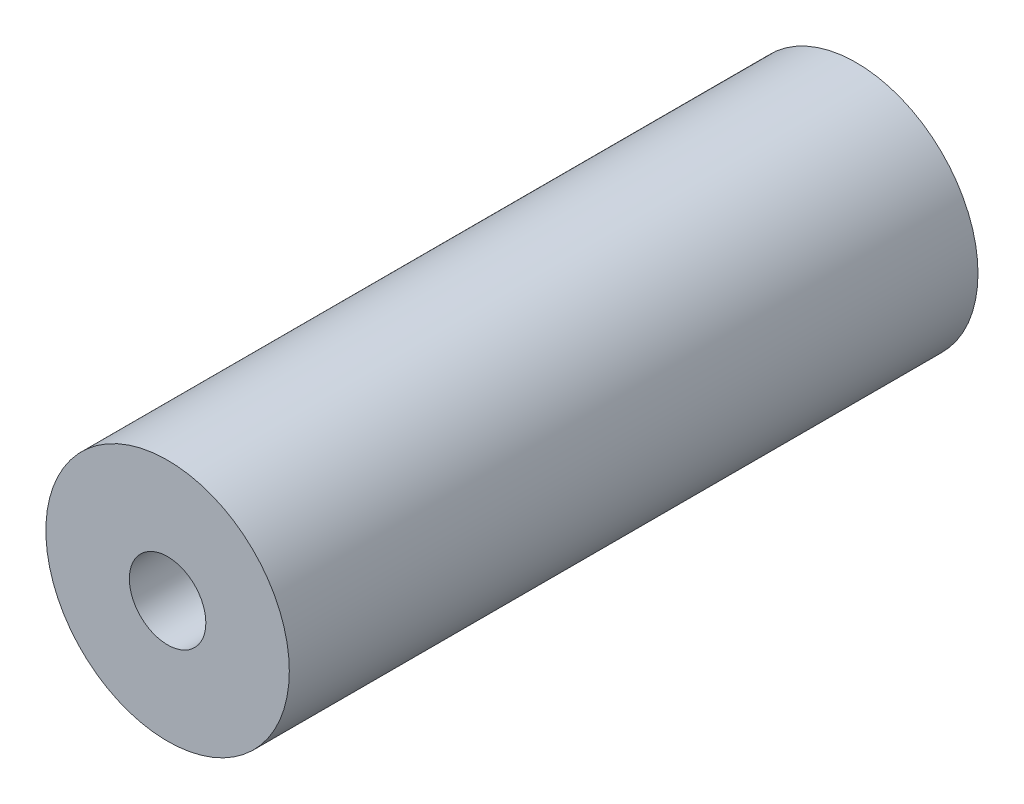
ISO-10303-21;
HEADER;
FILE_DESCRIPTION(('STEP AP214'),'2;1');
FILE_NAME('part.step','',(''),(''),'','','');
FILE_SCHEMA(('AUTOMOTIVE_DESIGN { 1 0 10303 214 1 1 1 1 }'));
ENDSEC;
DATA;
#1=APPLICATION_CONTEXT('core data for automotive mechanical design processes');
#2=APPLICATION_PROTOCOL_DEFINITION('international standard','automotive_design',2000,#1);
#3=PRODUCT_CONTEXT('',#1,'mechanical');
#4=PRODUCT('Part','Part','',(#3));
#5=PRODUCT_RELATED_PRODUCT_CATEGORY('part','',(#4));
#6=PRODUCT_DEFINITION_FORMATION('','',#4);
#7=PRODUCT_DEFINITION_CONTEXT('part definition',#1,'design');
#8=PRODUCT_DEFINITION('design','',#6,#7);
#9=PRODUCT_DEFINITION_SHAPE('','',#8);
#10=(LENGTH_UNIT() NAMED_UNIT(*) SI_UNIT(.MILLI.,.METRE.));
#11=(NAMED_UNIT(*) PLANE_ANGLE_UNIT() SI_UNIT($,.RADIAN.));
#12=(NAMED_UNIT(*) SI_UNIT($,.STERADIAN.) SOLID_ANGLE_UNIT());
#13=UNCERTAINTY_MEASURE_WITH_UNIT(LENGTH_MEASURE(1.E-05),#10,'distance_accuracy_value','');
#14=(GEOMETRIC_REPRESENTATION_CONTEXT(3) GLOBAL_UNCERTAINTY_ASSIGNED_CONTEXT((#13)) GLOBAL_UNIT_ASSIGNED_CONTEXT((#10,
#11,#12)) REPRESENTATION_CONTEXT('',''));
#15=CARTESIAN_POINT('',(0.,0.,0.));
#16=DIRECTION('',(0.,0.,1.));
#17=DIRECTION('',(1.,0.,0.));
#18=AXIS2_PLACEMENT_3D('',#15,#16,#17);
#19=CARTESIAN_POINT('',(0.,0.,99.));
#20=DIRECTION('',(0.,0.,-1.));
#21=DIRECTION('',(-1.,0.,0.));
#22=AXIS2_PLACEMENT_3D('',#19,#20,#21);
#23=CYLINDRICAL_SURFACE('',#22,17.5);
#24=CARTESIAN_POINT('',(0.,0.,99.));
#25=DIRECTION('',(0.,0.,1.));
#26=DIRECTION('',(1.,0.,0.));
#27=AXIS2_PLACEMENT_3D('',#24,#25,#26);
#28=CIRCLE('',#27,17.5);
#29=CARTESIAN_POINT('',(17.5,0.,99.));
#30=VERTEX_POINT('',#29);
#31=EDGE_CURVE('E10',#30,#30,#28,.T.);
#32=ORIENTED_EDGE('',*,*,#31,.F.);
#33=EDGE_LOOP('',(#32));
#34=FACE_BOUND('',#33,.T.);
#35=CARTESIAN_POINT('',(0.,0.,0.));
#36=DIRECTION('',(0.,0.,1.));
#37=DIRECTION('',(1.,0.,0.));
#38=AXIS2_PLACEMENT_3D('',#35,#36,#37);
#39=CIRCLE('',#38,17.5);
#40=CARTESIAN_POINT('',(17.5,0.,0.));
#41=VERTEX_POINT('',#40);
#42=EDGE_CURVE('E35',#41,#41,#39,.T.);
#43=ORIENTED_EDGE('',*,*,#42,.T.);
#44=EDGE_LOOP('',(#43));
#45=FACE_BOUND('',#44,.T.);
#46=ADVANCED_FACE('F32',(#34,#45),#23,.T.);
#47=CARTESIAN_POINT('',(0.,0.,99.));
#48=DIRECTION('',(0.,0.,1.));
#49=DIRECTION('',(1.,0.,0.));
#50=AXIS2_PLACEMENT_3D('',#47,#48,#49);
#51=PLANE('',#50);
#52=CARTESIAN_POINT('',(0.,0.,99.));
#53=DIRECTION('',(0.,0.,1.));
#54=DIRECTION('',(1.,0.,0.));
#55=AXIS2_PLACEMENT_3D('',#52,#53,#54);
#56=CIRCLE('',#55,5.5);
#57=CARTESIAN_POINT('',(5.5,0.,99.));
#58=VERTEX_POINT('',#57);
#59=EDGE_CURVE('E44',#58,#58,#56,.T.);
#60=ORIENTED_EDGE('',*,*,#59,.F.);
#61=EDGE_LOOP('',(#60));
#62=FACE_BOUND('',#61,.T.);
#63=ORIENTED_EDGE('',*,*,#31,.T.);
#64=EDGE_LOOP('',(#63));
#65=FACE_BOUND('',#64,.T.);
#66=ADVANCED_FACE('F59',(#62,#65),#51,.T.);
#67=CARTESIAN_POINT('',(0.,0.,0.));
#68=DIRECTION('',(0.,0.,1.));
#69=DIRECTION('',(1.,0.,0.));
#70=AXIS2_PLACEMENT_3D('',#67,#68,#69);
#71=PLANE('',#70);
#72=CARTESIAN_POINT('',(0.,0.,0.));
#73=DIRECTION('',(0.,0.,1.));
#74=DIRECTION('',(1.,0.,0.));
#75=AXIS2_PLACEMENT_3D('',#72,#73,#74);
#76=CIRCLE('',#75,5.5);
#77=CARTESIAN_POINT('',(5.5,0.,0.));
#78=VERTEX_POINT('',#77);
#79=EDGE_CURVE('E42',#78,#78,#76,.T.);
#80=ORIENTED_EDGE('',*,*,#79,.T.);
#81=EDGE_LOOP('',(#80));
#82=FACE_BOUND('',#81,.T.);
#83=ORIENTED_EDGE('',*,*,#42,.F.);
#84=EDGE_LOOP('',(#83));
#85=FACE_BOUND('',#84,.T.);
#86=ADVANCED_FACE('F50',(#82,#85),#71,.F.);
#87=CARTESIAN_POINT('',(0.,0.,0.));
#88=DIRECTION('',(0.,0.,1.));
#89=DIRECTION('',(1.,0.,0.));
#90=AXIS2_PLACEMENT_3D('',#87,#88,#89);
#91=CYLINDRICAL_SURFACE('',#90,5.5);
#92=ORIENTED_EDGE('',*,*,#79,.F.);
#93=EDGE_LOOP('',(#92));
#94=FACE_BOUND('',#93,.T.);
#95=ORIENTED_EDGE('',*,*,#59,.T.);
#96=EDGE_LOOP('',(#95));
#97=FACE_BOUND('',#96,.T.);
#98=ADVANCED_FACE('F53',(#94,#97),#91,.F.);
#99=CLOSED_SHELL('',(#46,#66,#86,#98));
#100=MANIFOLD_SOLID_BREP('B2',#99);
#101=ADVANCED_BREP_SHAPE_REPRESENTATION('',(#18,#100),#14);
#102=SHAPE_DEFINITION_REPRESENTATION(#9,#101);
ENDSEC;
END-ISO-10303-21;
